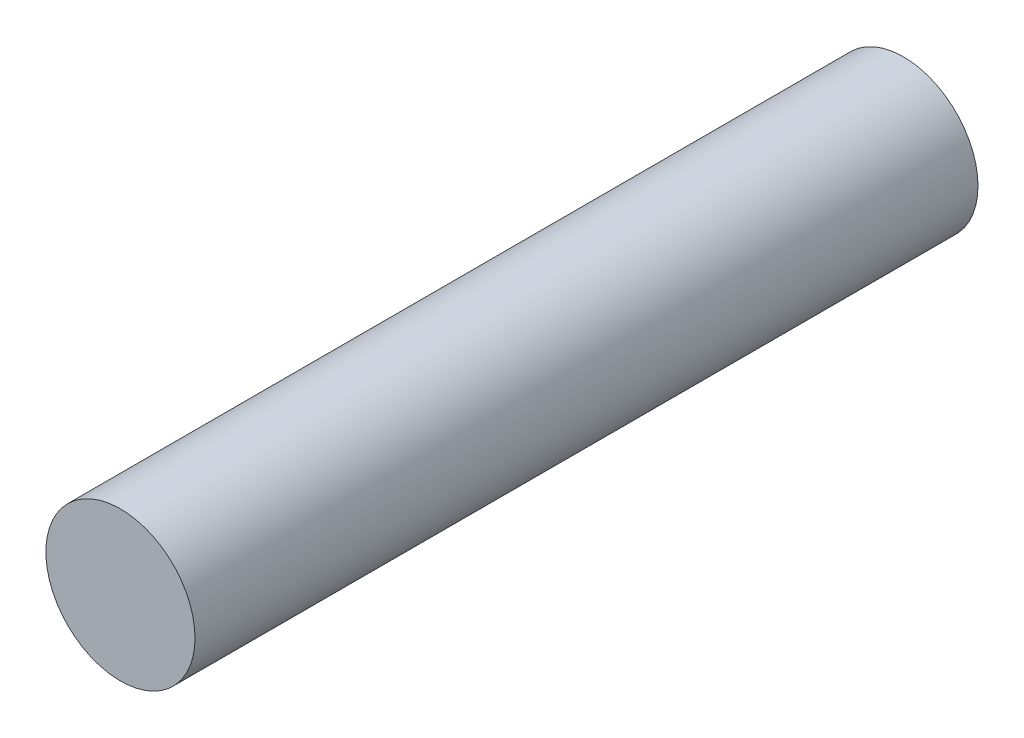
ISO-10303-21;
HEADER;
FILE_DESCRIPTION(('STEP AP214'),'2;1');
FILE_NAME('part.step','',(''),(''),'','','');
FILE_SCHEMA(('AUTOMOTIVE_DESIGN { 1 0 10303 214 1 1 1 1 }'));
ENDSEC;
DATA;
#1=APPLICATION_CONTEXT('core data for automotive mechanical design processes');
#2=APPLICATION_PROTOCOL_DEFINITION('international standard','automotive_design',2000,#1);
#3=PRODUCT_CONTEXT('',#1,'mechanical');
#4=PRODUCT('Part','Part','',(#3));
#5=PRODUCT_RELATED_PRODUCT_CATEGORY('part','',(#4));
#6=PRODUCT_DEFINITION_FORMATION('','',#4);
#7=PRODUCT_DEFINITION_CONTEXT('part definition',#1,'design');
#8=PRODUCT_DEFINITION('design','',#6,#7);
#9=PRODUCT_DEFINITION_SHAPE('','',#8);
#10=(LENGTH_UNIT() NAMED_UNIT(*) SI_UNIT(.MILLI.,.METRE.));
#11=(NAMED_UNIT(*) PLANE_ANGLE_UNIT() SI_UNIT($,.RADIAN.));
#12=(NAMED_UNIT(*) SI_UNIT($,.STERADIAN.) SOLID_ANGLE_UNIT());
#13=UNCERTAINTY_MEASURE_WITH_UNIT(LENGTH_MEASURE(1.E-05),#10,'distance_accuracy_value','');
#14=(GEOMETRIC_REPRESENTATION_CONTEXT(3) GLOBAL_UNCERTAINTY_ASSIGNED_CONTEXT((#13)) GLOBAL_UNIT_ASSIGNED_CONTEXT((#10,
#11,#12)) REPRESENTATION_CONTEXT('',''));
#15=CARTESIAN_POINT('',(0.,0.,0.));
#16=DIRECTION('',(0.,0.,1.));
#17=DIRECTION('',(1.,0.,0.));
#18=AXIS2_PLACEMENT_3D('',#15,#16,#17);
#19=CARTESIAN_POINT('',(0.,0.,133.35));
#20=DIRECTION('',(0.,0.,-1.));
#21=DIRECTION('',(-1.,0.,0.));
#22=AXIS2_PLACEMENT_3D('',#19,#20,#21);
#23=CYLINDRICAL_SURFACE('',#22,12.7);
#24=CARTESIAN_POINT('',(0.,0.,133.35));
#25=DIRECTION('',(0.,0.,1.));
#26=DIRECTION('',(1.,0.,0.));
#27=AXIS2_PLACEMENT_3D('',#24,#25,#26);
#28=CIRCLE('',#27,12.7);
#29=CARTESIAN_POINT('',(12.7,0.,133.35));
#30=VERTEX_POINT('',#29);
#31=EDGE_CURVE('E10',#30,#30,#28,.T.);
#32=ORIENTED_EDGE('',*,*,#31,.F.);
#33=EDGE_LOOP('',(#32));
#34=FACE_BOUND('',#33,.T.);
#35=CARTESIAN_POINT('',(0.,0.,0.));
#36=DIRECTION('',(0.,0.,1.));
#37=DIRECTION('',(1.,0.,0.));
#38=AXIS2_PLACEMENT_3D('',#35,#36,#37);
#39=CIRCLE('',#38,12.7);
#40=CARTESIAN_POINT('',(12.7,0.,0.));
#41=VERTEX_POINT('',#40);
#42=EDGE_CURVE('E34',#41,#41,#39,.T.);
#43=ORIENTED_EDGE('',*,*,#42,.T.);
#44=EDGE_LOOP('',(#43));
#45=FACE_BOUND('',#44,.T.);
#46=ADVANCED_FACE('F31',(#34,#45),#23,.T.);
#47=CARTESIAN_POINT('',(0.,0.,133.35));
#48=DIRECTION('',(0.,0.,1.));
#49=DIRECTION('',(1.,0.,0.));
#50=AXIS2_PLACEMENT_3D('',#47,#48,#49);
#51=PLANE('',#50);
#52=ORIENTED_EDGE('',*,*,#31,.T.);
#53=EDGE_LOOP('',(#52));
#54=FACE_BOUND('',#53,.T.);
#55=ADVANCED_FACE('F46',(#54),#51,.T.);
#56=CARTESIAN_POINT('',(0.,0.,0.));
#57=DIRECTION('',(0.,0.,1.));
#58=DIRECTION('',(1.,0.,0.));
#59=AXIS2_PLACEMENT_3D('',#56,#57,#58);
#60=PLANE('',#59);
#61=ORIENTED_EDGE('',*,*,#42,.F.);
#62=EDGE_LOOP('',(#61));
#63=FACE_BOUND('',#62,.T.);
#64=ADVANCED_FACE('F44',(#63),#60,.F.);
#65=CLOSED_SHELL('',(#46,#55,#64));
#66=MANIFOLD_SOLID_BREP('B2',#65);
#67=ADVANCED_BREP_SHAPE_REPRESENTATION('',(#18,#66),#14);
#68=SHAPE_DEFINITION_REPRESENTATION(#9,#67);
ENDSEC;
END-ISO-10303-21;
